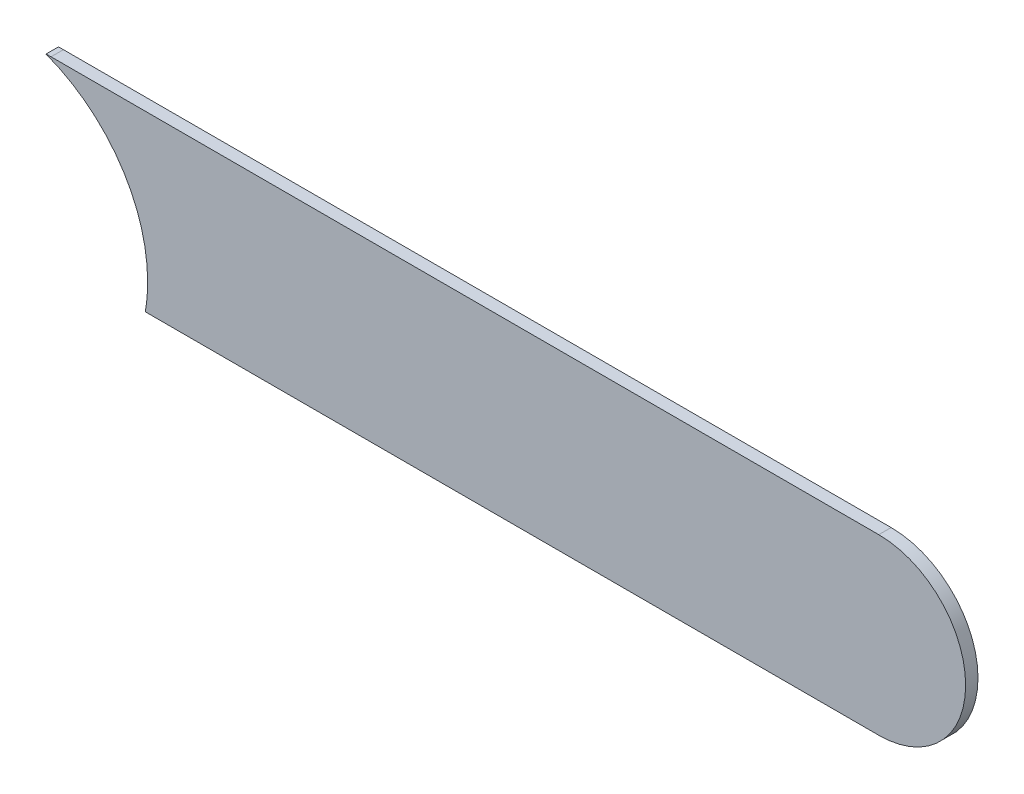
ISO-10303-21;
HEADER;
FILE_DESCRIPTION(('STEP AP214'),'2;1');
FILE_NAME('part.step','',(''),(''),'','','');
FILE_SCHEMA(('AUTOMOTIVE_DESIGN { 1 0 10303 214 1 1 1 1 }'));
ENDSEC;
DATA;
#1=APPLICATION_CONTEXT('core data for automotive mechanical design processes');
#2=APPLICATION_PROTOCOL_DEFINITION('international standard','automotive_design',2000,#1);
#3=PRODUCT_CONTEXT('',#1,'mechanical');
#4=PRODUCT('Part','Part','',(#3));
#5=PRODUCT_RELATED_PRODUCT_CATEGORY('part','',(#4));
#6=PRODUCT_DEFINITION_FORMATION('','',#4);
#7=PRODUCT_DEFINITION_CONTEXT('part definition',#1,'design');
#8=PRODUCT_DEFINITION('design','',#6,#7);
#9=PRODUCT_DEFINITION_SHAPE('','',#8);
#10=(LENGTH_UNIT() NAMED_UNIT(*) SI_UNIT(.MILLI.,.METRE.));
#11=(NAMED_UNIT(*) PLANE_ANGLE_UNIT() SI_UNIT($,.RADIAN.));
#12=(NAMED_UNIT(*) SI_UNIT($,.STERADIAN.) SOLID_ANGLE_UNIT());
#13=UNCERTAINTY_MEASURE_WITH_UNIT(LENGTH_MEASURE(1.E-05),#10,'distance_accuracy_value','');
#14=(GEOMETRIC_REPRESENTATION_CONTEXT(3) GLOBAL_UNCERTAINTY_ASSIGNED_CONTEXT((#13)) GLOBAL_UNIT_ASSIGNED_CONTEXT((#10,
#11,#12)) REPRESENTATION_CONTEXT('',''));
#15=CARTESIAN_POINT('',(0.,0.,0.));
#16=DIRECTION('',(0.,0.,1.));
#17=DIRECTION('',(1.,0.,0.));
#18=AXIS2_PLACEMENT_3D('',#15,#16,#17);
#19=CARTESIAN_POINT('',(94.2741891940341,104.24999978,0.));
#20=DIRECTION('',(0.,1.,0.));
#21=DIRECTION('',(1.,0.,0.));
#22=AXIS2_PLACEMENT_3D('',#19,#20,#21);
#23=PLANE('',#22);
#24=DIRECTION('',(1.,0.,0.));
#25=VECTOR('',#24,1.);
#26=CARTESIAN_POINT('',(94.00299208,104.24999978,0.03556));
#27=LINE('',#26,#25);
#28=CARTESIAN_POINT('',(94.2741891940341,104.24999978,0.03556));
#29=VERTEX_POINT('',#28);
#30=CARTESIAN_POINT('',(96.38512346,104.24999978,0.03556));
#31=VERTEX_POINT('',#30);
#32=EDGE_CURVE('E11',#29,#31,#27,.T.);
#33=ORIENTED_EDGE('',*,*,#32,.F.);
#34=DIRECTION('',(0.,0.,1.));
#35=VECTOR('',#34,1.);
#36=CARTESIAN_POINT('',(94.2741891940341,104.24999978,0.));
#37=LINE('',#36,#35);
#38=CARTESIAN_POINT('',(94.2741891940341,104.24999978,0.));
#39=VERTEX_POINT('',#38);
#40=EDGE_CURVE('E24',#39,#29,#37,.T.);
#41=ORIENTED_EDGE('',*,*,#40,.F.);
#42=DIRECTION('',(1.,0.,0.));
#43=VECTOR('',#42,1.);
#44=CARTESIAN_POINT('',(94.00299208,104.24999978,0.));
#45=LINE('',#44,#43);
#46=CARTESIAN_POINT('',(96.38512346,104.24999978,0.));
#47=VERTEX_POINT('',#46);
#48=EDGE_CURVE('E88',#39,#47,#45,.T.);
#49=ORIENTED_EDGE('',*,*,#48,.T.);
#50=DIRECTION('',(0.,0.,1.));
#51=VECTOR('',#50,1.);
#52=CARTESIAN_POINT('',(96.38512346,104.24999978,0.));
#53=LINE('',#52,#51);
#54=EDGE_CURVE('E37',#47,#31,#53,.T.);
#55=ORIENTED_EDGE('',*,*,#54,.T.);
#56=EDGE_LOOP('',(#33,#41,#49,#55));
#57=FACE_BOUND('',#56,.T.);
#58=ADVANCED_FACE('F17',(#57),#23,.F.);
#59=CARTESIAN_POINT('',(96.38512346,104.49999928,0.));
#60=DIRECTION('',(0.,0.,-1.));
#61=DIRECTION('',(1.13687065095746E-13,-1.,0.));
#62=AXIS2_PLACEMENT_3D('',#59,#60,#61);
#63=CYLINDRICAL_SURFACE('',#62,0.249999500000006);
#64=CARTESIAN_POINT('',(96.38512346,104.49999928,0.03556));
#65=DIRECTION('',(0.,0.,1.));
#66=DIRECTION('',(1.13687065095746E-13,-1.,0.));
#67=AXIS2_PLACEMENT_3D('',#64,#65,#66);
#68=CIRCLE('',#67,0.249999500000006);
#69=CARTESIAN_POINT('',(96.38512346,104.74999878,0.03556));
#70=VERTEX_POINT('',#69);
#71=EDGE_CURVE('E111',#31,#70,#68,.T.);
#72=ORIENTED_EDGE('',*,*,#71,.F.);
#73=ORIENTED_EDGE('',*,*,#54,.F.);
#74=CARTESIAN_POINT('',(96.38512346,104.49999928,0.));
#75=DIRECTION('',(0.,0.,1.));
#76=DIRECTION('',(1.13687065095746E-13,-1.,0.));
#77=AXIS2_PLACEMENT_3D('',#74,#75,#76);
#78=CIRCLE('',#77,0.249999500000006);
#79=CARTESIAN_POINT('',(96.38512346,104.74999878,0.));
#80=VERTEX_POINT('',#79);
#81=EDGE_CURVE('E108',#47,#80,#78,.T.);
#82=ORIENTED_EDGE('',*,*,#81,.T.);
#83=DIRECTION('',(0.,0.,1.));
#84=VECTOR('',#83,1.);
#85=CARTESIAN_POINT('',(96.38512346,104.74999878,0.));
#86=LINE('',#85,#84);
#87=EDGE_CURVE('E106',#80,#70,#86,.T.);
#88=ORIENTED_EDGE('',*,*,#87,.T.);
#89=EDGE_LOOP('',(#72,#73,#82,#88));
#90=FACE_BOUND('',#89,.T.);
#91=ADVANCED_FACE('F118',(#90),#63,.T.);
#92=CARTESIAN_POINT('',(96.38512346,104.74999878,0.));
#93=DIRECTION('',(0.,-1.,0.));
#94=DIRECTION('',(-1.,0.,0.));
#95=AXIS2_PLACEMENT_3D('',#92,#93,#94);
#96=PLANE('',#95);
#97=DIRECTION('',(-1.,0.,0.));
#98=VECTOR('',#97,1.);
#99=CARTESIAN_POINT('',(96.38512346,104.74999878,0.03556));
#100=LINE('',#99,#98);
#101=CARTESIAN_POINT('',(94.00299208,104.74999878,0.03556));
#102=VERTEX_POINT('',#101);
#103=EDGE_CURVE('E103',#70,#102,#100,.T.);
#104=ORIENTED_EDGE('',*,*,#103,.F.);
#105=ORIENTED_EDGE('',*,*,#87,.F.);
#106=DIRECTION('',(-1.,0.,0.));
#107=VECTOR('',#106,1.);
#108=CARTESIAN_POINT('',(96.38512346,104.74999878,0.));
#109=LINE('',#108,#107);
#110=CARTESIAN_POINT('',(94.00299208,104.74999878,0.));
#111=VERTEX_POINT('',#110);
#112=EDGE_CURVE('E100',#80,#111,#109,.T.);
#113=ORIENTED_EDGE('',*,*,#112,.T.);
#114=DIRECTION('',(0.,0.,1.));
#115=VECTOR('',#114,1.);
#116=CARTESIAN_POINT('',(94.00299208,104.74999878,0.));
#117=LINE('',#116,#115);
#118=EDGE_CURVE('E98',#111,#102,#117,.T.);
#119=ORIENTED_EDGE('',*,*,#118,.T.);
#120=EDGE_LOOP('',(#104,#105,#113,#119));
#121=FACE_BOUND('',#120,.T.);
#122=ADVANCED_FACE('F124',(#121),#96,.F.);
#123=CARTESIAN_POINT('',(94.00299208,104.49999928,0.));
#124=DIRECTION('',(0.,0.,-1.));
#125=DIRECTION('',(0.,1.,0.));
#126=AXIS2_PLACEMENT_3D('',#123,#124,#125);
#127=CYLINDRICAL_SURFACE('',#126,0.249999500000001);
#128=CARTESIAN_POINT('',(94.00299208,104.49999928,0.03556));
#129=DIRECTION('',(0.,0.,1.));
#130=DIRECTION('',(0.,1.,0.));
#131=AXIS2_PLACEMENT_3D('',#128,#129,#130);
#132=CIRCLE('',#131,0.249999500000001);
#133=CARTESIAN_POINT('',(93.9884308933946,104.74957436258,0.03556));
#134=VERTEX_POINT('',#133);
#135=EDGE_CURVE('E95',#102,#134,#132,.T.);
#136=ORIENTED_EDGE('',*,*,#135,.F.);
#137=ORIENTED_EDGE('',*,*,#118,.F.);
#138=CARTESIAN_POINT('',(94.00299208,104.49999928,0.));
#139=DIRECTION('',(0.,0.,1.));
#140=DIRECTION('',(0.,1.,0.));
#141=AXIS2_PLACEMENT_3D('',#138,#139,#140);
#142=CIRCLE('',#141,0.249999500000001);
#143=CARTESIAN_POINT('',(93.9884308933946,104.74957436258,0.));
#144=VERTEX_POINT('',#143);
#145=EDGE_CURVE('E93',#111,#144,#142,.T.);
#146=ORIENTED_EDGE('',*,*,#145,.T.);
#147=DIRECTION('',(0.,0.,1.));
#148=VECTOR('',#147,1.);
#149=CARTESIAN_POINT('',(93.9884308933946,104.74957436258,0.));
#150=LINE('',#149,#148);
#151=EDGE_CURVE('E75',#144,#134,#150,.T.);
#152=ORIENTED_EDGE('',*,*,#151,.T.);
#153=EDGE_LOOP('',(#136,#137,#146,#152));
#154=FACE_BOUND('',#153,.T.);
#155=ADVANCED_FACE('F126',(#154),#127,.T.);
#156=CARTESIAN_POINT('',(93.8310036,104.3280108,0.));
#157=DIRECTION('',(0.,0.,-1.));
#158=DIRECTION('',(1.,0.,0.));
#159=AXIS2_PLACEMENT_3D('',#156,#157,#158);
#160=CYLINDRICAL_SURFACE('',#159,0.4499991);
#161=DIRECTION('',(0.,0.,1.));
#162=VECTOR('',#161,1.);
#163=CARTESIAN_POINT('',(94.2810027,104.3280108,0.));
#164=LINE('',#163,#162);
#165=CARTESIAN_POINT('',(94.2810027,104.3280108,0.));
#166=VERTEX_POINT('',#165);
#167=CARTESIAN_POINT('',(94.2810027,104.3280108,0.03556));
#168=VERTEX_POINT('',#167);
#169=EDGE_CURVE('E65',#166,#168,#164,.T.);
#170=ORIENTED_EDGE('',*,*,#169,.T.);
#171=CARTESIAN_POINT('',(93.8310036,104.3280108,0.03556));
#172=DIRECTION('',(0.,0.,1.));
#173=DIRECTION('',(1.,0.,0.));
#174=AXIS2_PLACEMENT_3D('',#171,#172,#173);
#175=CIRCLE('',#174,0.4499991);
#176=EDGE_CURVE('E76',#168,#134,#175,.T.);
#177=ORIENTED_EDGE('',*,*,#176,.T.);
#178=ORIENTED_EDGE('',*,*,#151,.F.);
#179=CARTESIAN_POINT('',(93.8310036,104.3280108,0.));
#180=DIRECTION('',(0.,0.,1.));
#181=DIRECTION('',(1.,0.,0.));
#182=AXIS2_PLACEMENT_3D('',#179,#180,#181);
#183=CIRCLE('',#182,0.4499991);
#184=EDGE_CURVE('E79',#166,#144,#183,.T.);
#185=ORIENTED_EDGE('',*,*,#184,.F.);
#186=EDGE_LOOP('',(#170,#177,#178,#185));
#187=FACE_BOUND('',#186,.T.);
#188=ADVANCED_FACE('F80',(#187),#160,.F.);
#189=CARTESIAN_POINT('',(93.8310036,104.3280108,0.));
#190=DIRECTION('',(0.,0.,-1.));
#191=DIRECTION('',(1.,0.,0.));
#192=AXIS2_PLACEMENT_3D('',#189,#190,#191);
#193=CYLINDRICAL_SURFACE('',#192,0.4499991);
#194=ORIENTED_EDGE('',*,*,#40,.T.);
#195=CARTESIAN_POINT('',(93.8310036,104.3280108,0.03556));
#196=DIRECTION('',(0.,0.,1.));
#197=DIRECTION('',(1.,0.,0.));
#198=AXIS2_PLACEMENT_3D('',#195,#196,#197);
#199=CIRCLE('',#198,0.4499991);
#200=EDGE_CURVE('E71',#29,#168,#199,.T.);
#201=ORIENTED_EDGE('',*,*,#200,.T.);
#202=ORIENTED_EDGE('',*,*,#169,.F.);
#203=EDGE_CURVE('E69',#39,#166,#183,.T.);
#204=ORIENTED_EDGE('',*,*,#203,.F.);
#205=EDGE_LOOP('',(#194,#201,#202,#204));
#206=FACE_BOUND('',#205,.T.);
#207=ADVANCED_FACE('F67',(#206),#193,.F.);
#208=CARTESIAN_POINT('',(94.00299208,104.24999978,0.));
#209=DIRECTION('',(0.,0.,-1.));
#210=DIRECTION('',(-1.,0.,0.));
#211=AXIS2_PLACEMENT_3D('',#208,#209,#210);
#212=PLANE('',#211);
#213=ORIENTED_EDGE('',*,*,#48,.F.);
#214=ORIENTED_EDGE('',*,*,#203,.T.);
#215=ORIENTED_EDGE('',*,*,#184,.T.);
#216=ORIENTED_EDGE('',*,*,#145,.F.);
#217=ORIENTED_EDGE('',*,*,#112,.F.);
#218=ORIENTED_EDGE('',*,*,#81,.F.);
#219=EDGE_LOOP('',(#213,#214,#215,#216,#217,#218));
#220=FACE_BOUND('',#219,.T.);
#221=ADVANCED_FACE('F86',(#220),#212,.T.);
#222=CARTESIAN_POINT('',(94.00299208,104.24999978,0.03556));
#223=DIRECTION('',(0.,0.,-1.));
#224=DIRECTION('',(-1.,0.,0.));
#225=AXIS2_PLACEMENT_3D('',#222,#223,#224);
#226=PLANE('',#225);
#227=ORIENTED_EDGE('',*,*,#200,.F.);
#228=ORIENTED_EDGE('',*,*,#32,.T.);
#229=ORIENTED_EDGE('',*,*,#71,.T.);
#230=ORIENTED_EDGE('',*,*,#103,.T.);
#231=ORIENTED_EDGE('',*,*,#135,.T.);
#232=ORIENTED_EDGE('',*,*,#176,.F.);
#233=EDGE_LOOP('',(#227,#228,#229,#230,#231,#232));
#234=FACE_BOUND('',#233,.T.);
#235=ADVANCED_FACE('F121',(#234),#226,.F.);
#236=CLOSED_SHELL('',(#58,#91,#122,#155,#188,#207,#221,#235));
#237=MANIFOLD_SOLID_BREP('B1',#236);
#238=ADVANCED_BREP_SHAPE_REPRESENTATION('',(#18,#237),#14);
#239=SHAPE_DEFINITION_REPRESENTATION(#9,#238);
ENDSEC;
END-ISO-10303-21;
